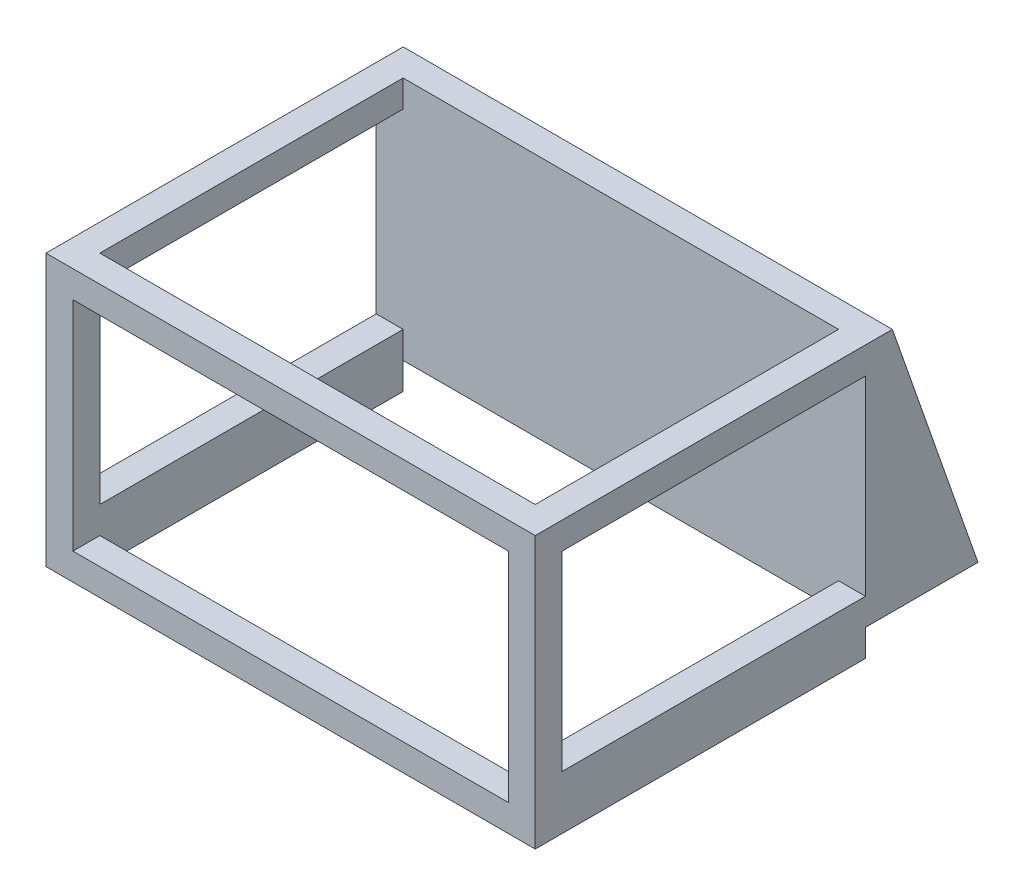
ISO-10303-21;
HEADER;
FILE_DESCRIPTION(('STEP AP214'),'2;1');
FILE_NAME('part.step','',(''),(''),'','','');
FILE_SCHEMA(('AUTOMOTIVE_DESIGN { 1 0 10303 214 1 1 1 1 }'));
ENDSEC;
DATA;
#1=APPLICATION_CONTEXT('core data for automotive mechanical design processes');
#2=APPLICATION_PROTOCOL_DEFINITION('international standard','automotive_design',2000,#1);
#3=PRODUCT_CONTEXT('',#1,'mechanical');
#4=PRODUCT('Part','Part','',(#3));
#5=PRODUCT_RELATED_PRODUCT_CATEGORY('part','',(#4));
#6=PRODUCT_DEFINITION_FORMATION('','',#4);
#7=PRODUCT_DEFINITION_CONTEXT('part definition',#1,'design');
#8=PRODUCT_DEFINITION('design','',#6,#7);
#9=PRODUCT_DEFINITION_SHAPE('','',#8);
#10=(LENGTH_UNIT() NAMED_UNIT(*) SI_UNIT(.MILLI.,.METRE.));
#11=(NAMED_UNIT(*) PLANE_ANGLE_UNIT() SI_UNIT($,.RADIAN.));
#12=(NAMED_UNIT(*) SI_UNIT($,.STERADIAN.) SOLID_ANGLE_UNIT());
#13=UNCERTAINTY_MEASURE_WITH_UNIT(LENGTH_MEASURE(1.E-05),#10,'distance_accuracy_value','');
#14=(GEOMETRIC_REPRESENTATION_CONTEXT(3) GLOBAL_UNCERTAINTY_ASSIGNED_CONTEXT((#13)) GLOBAL_UNIT_ASSIGNED_CONTEXT((#10,
#11,#12)) REPRESENTATION_CONTEXT('',''));
#15=CARTESIAN_POINT('',(0.,0.,0.));
#16=DIRECTION('',(0.,0.,1.));
#17=DIRECTION('',(1.,0.,0.));
#18=AXIS2_PLACEMENT_3D('',#15,#16,#17);
#19=CARTESIAN_POINT('',(0.,0.,0.));
#20=DIRECTION('',(0.,0.,1.));
#21=DIRECTION('',(1.,0.,0.));
#22=AXIS2_PLACEMENT_3D('',#19,#20,#21);
#23=PLANE('',#22);
#24=DIRECTION('',(0.,1.,0.));
#25=VECTOR('',#24,1.);
#26=CARTESIAN_POINT('',(-158.07662835249,-108.429118773946,0.));
#27=LINE('',#26,#25);
#28=CARTESIAN_POINT('',(-158.07662835249,-108.429118773946,0.));
#29=VERTEX_POINT('',#28);
#30=CARTESIAN_POINT('',(-158.07662835249,91.5708812260536,0.));
#31=VERTEX_POINT('',#30);
#32=EDGE_CURVE('E218',#29,#31,#27,.T.);
#33=ORIENTED_EDGE('',*,*,#32,.T.);
#34=DIRECTION('',(-1.,0.,0.));
#35=VECTOR('',#34,1.);
#36=CARTESIAN_POINT('',(-180.07662835249,91.5708812260537,0.));
#37=LINE('',#36,#35);
#38=CARTESIAN_POINT('',(197.92337164751,91.5708812260537,0.));
#39=VERTEX_POINT('',#38);
#40=EDGE_CURVE('E223',#39,#31,#37,.T.);
#41=ORIENTED_EDGE('',*,*,#40,.F.);
#42=DIRECTION('',(0.,-1.,0.));
#43=VECTOR('',#42,1.);
#44=CARTESIAN_POINT('',(197.92337164751,-108.429118773946,0.));
#45=LINE('',#44,#43);
#46=CARTESIAN_POINT('',(197.92337164751,-108.429118773946,0.));
#47=VERTEX_POINT('',#46);
#48=EDGE_CURVE('E356',#39,#47,#45,.T.);
#49=ORIENTED_EDGE('',*,*,#48,.T.);
#50=DIRECTION('',(1.,0.,0.));
#51=VECTOR('',#50,1.);
#52=CARTESIAN_POINT('',(-180.07662835249,-108.429118773946,0.));
#53=LINE('',#52,#51);
#54=EDGE_CURVE('E37',#29,#47,#53,.T.);
#55=ORIENTED_EDGE('',*,*,#54,.F.);
#56=EDGE_LOOP('',(#33,#41,#49,#55));
#57=FACE_BOUND('',#56,.T.);
#58=ADVANCED_FACE('F33',(#57),#23,.F.);
#59=CARTESIAN_POINT('',(-158.07662835249,91.5708812260537,270.));
#60=DIRECTION('',(0.,0.,1.));
#61=DIRECTION('',(1.,0.,0.));
#62=AXIS2_PLACEMENT_3D('',#59,#60,#61);
#63=PLANE('',#62);
#64=DIRECTION('',(1.,0.,0.));
#65=VECTOR('',#64,1.);
#66=CARTESIAN_POINT('',(-180.07662835249,69.5708812260536,270.));
#67=LINE('',#66,#65);
#68=CARTESIAN_POINT('',(-180.07662835249,69.5708812260536,270.));
#69=VERTEX_POINT('',#68);
#70=CARTESIAN_POINT('',(-158.07662835249,69.5708812260536,270.));
#71=VERTEX_POINT('',#70);
#72=EDGE_CURVE('E281',#69,#71,#67,.T.);
#73=ORIENTED_EDGE('',*,*,#72,.T.);
#74=DIRECTION('',(0.,-1.,0.));
#75=VECTOR('',#74,1.);
#76=CARTESIAN_POINT('',(-158.07662835249,91.5708812260537,270.));
#77=LINE('',#76,#75);
#78=CARTESIAN_POINT('',(-158.07662835249,-86.4291187739464,270.));
#79=VERTEX_POINT('',#78);
#80=EDGE_CURVE('E293',#71,#79,#77,.T.);
#81=ORIENTED_EDGE('',*,*,#80,.T.);
#82=DIRECTION('',(1.,0.,0.));
#83=VECTOR('',#82,1.);
#84=CARTESIAN_POINT('',(-180.07662835249,-86.4291187739464,270.));
#85=LINE('',#84,#83);
#86=CARTESIAN_POINT('',(-180.07662835249,-86.4291187739464,270.));
#87=VERTEX_POINT('',#86);
#88=EDGE_CURVE('E449',#87,#79,#85,.T.);
#89=ORIENTED_EDGE('',*,*,#88,.F.);
#90=DIRECTION('',(0.,-1.,0.));
#91=VECTOR('',#90,1.);
#92=CARTESIAN_POINT('',(-180.07662835249,69.5708812260536,270.));
#93=LINE('',#92,#91);
#94=EDGE_CURVE('E296',#69,#87,#93,.T.);
#95=ORIENTED_EDGE('',*,*,#94,.F.);
#96=EDGE_LOOP('',(#73,#81,#89,#95));
#97=FACE_BOUND('',#96,.T.);
#98=ADVANCED_FACE('F292',(#97),#63,.F.);
#99=DIRECTION('',(0.,-1.,0.));
#100=VECTOR('',#99,1.);
#101=CARTESIAN_POINT('',(197.92337164751,91.5708812260537,270.));
#102=LINE('',#101,#100);
#103=CARTESIAN_POINT('',(197.92337164751,91.5708812260537,270.));
#104=VERTEX_POINT('',#103);
#105=CARTESIAN_POINT('',(197.92337164751,69.5708812260536,270.));
#106=VERTEX_POINT('',#105);
#107=EDGE_CURVE('E269',#104,#106,#102,.T.);
#108=ORIENTED_EDGE('',*,*,#107,.T.);
#109=DIRECTION('',(-1.,0.,0.));
#110=VECTOR('',#109,1.);
#111=CARTESIAN_POINT('',(-158.07662835249,69.5708812260536,270.));
#112=LINE('',#111,#110);
#113=EDGE_CURVE('E43',#106,#71,#112,.T.);
#114=ORIENTED_EDGE('',*,*,#113,.T.);
#115=DIRECTION('',(0.,-1.,0.));
#116=VECTOR('',#115,1.);
#117=CARTESIAN_POINT('',(-158.07662835249,91.5708812260537,270.));
#118=LINE('',#117,#116);
#119=CARTESIAN_POINT('',(-158.07662835249,91.5708812260537,270.));
#120=VERTEX_POINT('',#119);
#121=EDGE_CURVE('E230',#120,#71,#118,.T.);
#122=ORIENTED_EDGE('',*,*,#121,.F.);
#123=DIRECTION('',(-1.,0.,0.));
#124=VECTOR('',#123,1.);
#125=CARTESIAN_POINT('',(-158.07662835249,91.5708812260537,270.));
#126=LINE('',#125,#124);
#127=EDGE_CURVE('E308',#104,#120,#126,.T.);
#128=ORIENTED_EDGE('',*,*,#127,.F.);
#129=EDGE_LOOP('',(#108,#114,#122,#128));
#130=FACE_BOUND('',#129,.T.);
#131=ADVANCED_FACE('F265',(#130),#63,.F.);
#132=CARTESIAN_POINT('',(197.92337164751,-86.4291187739464,270.));
#133=VERTEX_POINT('',#132);
#134=CARTESIAN_POINT('',(219.92337164751,-86.4291187739464,270.));
#135=VERTEX_POINT('',#134);
#136=EDGE_CURVE('E443',#133,#135,#85,.T.);
#137=ORIENTED_EDGE('',*,*,#136,.F.);
#138=DIRECTION('',(0.,1.,0.));
#139=VECTOR('',#138,1.);
#140=CARTESIAN_POINT('',(197.92337164751,91.5708812260537,270.));
#141=LINE('',#140,#139);
#142=EDGE_CURVE('E429',#133,#106,#141,.T.);
#143=ORIENTED_EDGE('',*,*,#142,.T.);
#144=CARTESIAN_POINT('',(219.92337164751,69.5708812260536,270.));
#145=VERTEX_POINT('',#144);
#146=EDGE_CURVE('E297',#106,#145,#67,.T.);
#147=ORIENTED_EDGE('',*,*,#146,.T.);
#148=DIRECTION('',(0.,-1.,0.));
#149=VECTOR('',#148,1.);
#150=CARTESIAN_POINT('',(219.92337164751,69.5708812260536,270.));
#151=LINE('',#150,#149);
#152=EDGE_CURVE('E435',#145,#135,#151,.T.);
#153=ORIENTED_EDGE('',*,*,#152,.T.);
#154=EDGE_LOOP('',(#137,#143,#147,#153));
#155=FACE_BOUND('',#154,.T.);
#156=ADVANCED_FACE('F474',(#155),#63,.F.);
#157=CARTESIAN_POINT('',(-158.07662835249,91.5708812260537,270.));
#158=DIRECTION('',(-1.,0.,0.));
#159=DIRECTION('',(0.,0.,1.));
#160=AXIS2_PLACEMENT_3D('',#157,#158,#159);
#161=PLANE('',#160);
#162=DIRECTION('',(0.,0.,-1.));
#163=VECTOR('',#162,1.);
#164=CARTESIAN_POINT('',(-158.07662835249,69.5708812260536,270.));
#165=LINE('',#164,#163);
#166=CARTESIAN_POINT('',(-158.07662835249,69.5708812260536,22.));
#167=VERTEX_POINT('',#166);
#168=EDGE_CURVE('E277',#71,#167,#165,.T.);
#169=ORIENTED_EDGE('',*,*,#168,.T.);
#170=DIRECTION('',(0.,1.,0.));
#171=VECTOR('',#170,1.);
#172=CARTESIAN_POINT('',(-158.07662835249,91.5708812260537,22.));
#173=LINE('',#172,#171);
#174=CARTESIAN_POINT('',(-158.07662835249,91.5708812260536,22.));
#175=VERTEX_POINT('',#174);
#176=EDGE_CURVE('E303',#167,#175,#173,.T.);
#177=ORIENTED_EDGE('',*,*,#176,.T.);
#178=DIRECTION('',(0.,0.,-1.));
#179=VECTOR('',#178,1.);
#180=CARTESIAN_POINT('',(-158.07662835249,91.5708812260537,270.));
#181=LINE('',#180,#179);
#182=EDGE_CURVE('E301',#120,#175,#181,.T.);
#183=ORIENTED_EDGE('',*,*,#182,.F.);
#184=ORIENTED_EDGE('',*,*,#121,.T.);
#185=EDGE_LOOP('',(#169,#177,#183,#184));
#186=FACE_BOUND('',#185,.T.);
#187=ADVANCED_FACE('F299',(#186),#161,.F.);
#188=CARTESIAN_POINT('',(197.92337164751,91.5708812260537,270.));
#189=DIRECTION('',(1.,0.,0.));
#190=DIRECTION('',(0.,0.,-1.));
#191=AXIS2_PLACEMENT_3D('',#188,#189,#190);
#192=PLANE('',#191);
#193=DIRECTION('',(0.,0.,1.));
#194=VECTOR('',#193,1.);
#195=CARTESIAN_POINT('',(197.92337164751,91.5708812260537,270.));
#196=LINE('',#195,#194);
#197=CARTESIAN_POINT('',(197.92337164751,91.5708812260537,22.0000000000001));
#198=VERTEX_POINT('',#197);
#199=EDGE_CURVE('E305',#198,#104,#196,.T.);
#200=ORIENTED_EDGE('',*,*,#199,.F.);
#201=DIRECTION('',(0.,-1.,0.));
#202=VECTOR('',#201,1.);
#203=CARTESIAN_POINT('',(197.92337164751,91.5708812260537,22.));
#204=LINE('',#203,#202);
#205=CARTESIAN_POINT('',(197.92337164751,69.5708812260536,22.));
#206=VERTEX_POINT('',#205);
#207=EDGE_CURVE('E387',#198,#206,#204,.T.);
#208=ORIENTED_EDGE('',*,*,#207,.T.);
#209=DIRECTION('',(0.,0.,1.));
#210=VECTOR('',#209,1.);
#211=CARTESIAN_POINT('',(197.92337164751,69.5708812260536,270.));
#212=LINE('',#211,#210);
#213=EDGE_CURVE('E259',#206,#106,#212,.T.);
#214=ORIENTED_EDGE('',*,*,#213,.T.);
#215=ORIENTED_EDGE('',*,*,#107,.F.);
#216=EDGE_LOOP('',(#200,#208,#214,#215));
#217=FACE_BOUND('',#216,.T.);
#218=ADVANCED_FACE('F466',(#217),#192,.F.);
#219=CARTESIAN_POINT('',(-180.07662835249,91.5708812260537,292.));
#220=DIRECTION('',(1.,0.,0.));
#221=DIRECTION('',(0.,0.,-1.));
#222=AXIS2_PLACEMENT_3D('',#219,#220,#221);
#223=PLANE('',#222);
#224=DIRECTION('',(0.,-1.,0.));
#225=VECTOR('',#224,1.);
#226=CARTESIAN_POINT('',(-180.07662835249,-108.429118773946,22.));
#227=LINE('',#226,#225);
#228=CARTESIAN_POINT('',(-180.07662835249,69.5708812260536,22.));
#229=VERTEX_POINT('',#228);
#230=CARTESIAN_POINT('',(-180.07662835249,-86.4291187739464,22.));
#231=VERTEX_POINT('',#230);
#232=EDGE_CURVE('E367',#229,#231,#227,.T.);
#233=ORIENTED_EDGE('',*,*,#232,.F.);
#234=DIRECTION('',(0.,0.,1.));
#235=VECTOR('',#234,1.);
#236=CARTESIAN_POINT('',(-180.07662835249,69.5708812260536,270.));
#237=LINE('',#236,#235);
#238=EDGE_CURVE('E441',#229,#69,#237,.T.);
#239=ORIENTED_EDGE('',*,*,#238,.T.);
#240=ORIENTED_EDGE('',*,*,#94,.T.);
#241=DIRECTION('',(0.,0.,-1.));
#242=VECTOR('',#241,1.);
#243=CARTESIAN_POINT('',(-180.07662835249,-86.4291187739464,270.));
#244=LINE('',#243,#242);
#245=EDGE_CURVE('E437',#87,#231,#244,.T.);
#246=ORIENTED_EDGE('',*,*,#245,.T.);
#247=EDGE_LOOP('',(#233,#239,#240,#246));
#248=FACE_BOUND('',#247,.T.);
#249=DIRECTION('',(0.,0.,-1.));
#250=VECTOR('',#249,1.);
#251=CARTESIAN_POINT('',(-180.07662835249,91.5708812260537,292.));
#252=LINE('',#251,#250);
#253=CARTESIAN_POINT('',(-180.07662835249,91.5708812260537,292.));
#254=VERTEX_POINT('',#253);
#255=CARTESIAN_POINT('',(-180.07662835249,91.5708812260536,0.));
#256=VERTEX_POINT('',#255);
#257=EDGE_CURVE('E245',#254,#256,#252,.T.);
#258=ORIENTED_EDGE('',*,*,#257,.T.);
#259=DIRECTION('',(0.,-0.943858356366017,-0.330350424728106));
#260=VECTOR('',#259,1.);
#261=CARTESIAN_POINT('',(-180.07662835249,91.5708812260536,0.));
#262=LINE('',#261,#260);
#263=CARTESIAN_POINT('',(-180.07662835249,-108.429118773946,-70.));
#264=VERTEX_POINT('',#263);
#265=EDGE_CURVE('E208',#256,#264,#262,.T.);
#266=ORIENTED_EDGE('',*,*,#265,.T.);
#267=DIRECTION('',(0.,0.,1.));
#268=VECTOR('',#267,1.);
#269=CARTESIAN_POINT('',(-180.07662835249,-108.429118773946,0.));
#270=LINE('',#269,#268);
#271=CARTESIAN_POINT('',(-180.07662835249,-108.429118773946,22.));
#272=VERTEX_POINT('',#271);
#273=EDGE_CURVE('E393',#264,#272,#270,.T.);
#274=ORIENTED_EDGE('',*,*,#273,.T.);
#275=DIRECTION('',(0.,-1.,0.));
#276=VECTOR('',#275,1.);
#277=CARTESIAN_POINT('',(-180.07662835249,-130.429118773946,22.));
#278=LINE('',#277,#276);
#279=CARTESIAN_POINT('',(-180.07662835249,-130.429118773946,22.));
#280=VERTEX_POINT('',#279);
#281=EDGE_CURVE('E336',#272,#280,#278,.T.);
#282=ORIENTED_EDGE('',*,*,#281,.T.);
#283=DIRECTION('',(0.,0.,-1.));
#284=VECTOR('',#283,1.);
#285=CARTESIAN_POINT('',(-180.07662835249,-130.429118773946,292.));
#286=LINE('',#285,#284);
#287=CARTESIAN_POINT('',(-180.07662835249,-130.429118773946,292.));
#288=VERTEX_POINT('',#287);
#289=EDGE_CURVE('E253',#288,#280,#286,.T.);
#290=ORIENTED_EDGE('',*,*,#289,.F.);
#291=DIRECTION('',(0.,-1.,0.));
#292=VECTOR('',#291,1.);
#293=CARTESIAN_POINT('',(-180.07662835249,91.5708812260537,292.));
#294=LINE('',#293,#292);
#295=EDGE_CURVE('E232',#254,#288,#294,.T.);
#296=ORIENTED_EDGE('',*,*,#295,.F.);
#297=EDGE_LOOP('',(#258,#266,#274,#282,#290,#296));
#298=FACE_BOUND('',#297,.T.);
#299=ADVANCED_FACE('F35',(#248,#298),#223,.F.);
#300=CARTESIAN_POINT('',(-180.07662835249,-130.429118773946,292.));
#301=DIRECTION('',(0.,1.,0.));
#302=DIRECTION('',(0.,0.,1.));
#303=AXIS2_PLACEMENT_3D('',#300,#301,#302);
#304=PLANE('',#303);
#305=ORIENTED_EDGE('',*,*,#289,.T.);
#306=DIRECTION('',(1.,0.,0.));
#307=VECTOR('',#306,1.);
#308=CARTESIAN_POINT('',(-180.07662835249,-130.429118773946,22.));
#309=LINE('',#308,#307);
#310=CARTESIAN_POINT('',(-158.07662835249,-130.429118773946,22.));
#311=VERTEX_POINT('',#310);
#312=EDGE_CURVE('E341',#280,#311,#309,.T.);
#313=ORIENTED_EDGE('',*,*,#312,.T.);
#314=DIRECTION('',(0.,0.,-1.));
#315=VECTOR('',#314,1.);
#316=CARTESIAN_POINT('',(-158.07662835249,-130.429118773946,270.));
#317=LINE('',#316,#315);
#318=CARTESIAN_POINT('',(-158.07662835249,-130.429118773946,270.));
#319=VERTEX_POINT('',#318);
#320=EDGE_CURVE('E287',#319,#311,#317,.T.);
#321=ORIENTED_EDGE('',*,*,#320,.F.);
#322=DIRECTION('',(-1.,0.,0.));
#323=VECTOR('',#322,1.);
#324=CARTESIAN_POINT('',(-158.07662835249,-130.429118773946,270.));
#325=LINE('',#324,#323);
#326=CARTESIAN_POINT('',(197.92337164751,-130.429118773946,270.));
#327=VERTEX_POINT('',#326);
#328=EDGE_CURVE('E306',#327,#319,#325,.T.);
#329=ORIENTED_EDGE('',*,*,#328,.F.);
#330=DIRECTION('',(0.,0.,1.));
#331=VECTOR('',#330,1.);
#332=CARTESIAN_POINT('',(197.92337164751,-130.429118773946,270.));
#333=LINE('',#332,#331);
#334=CARTESIAN_POINT('',(197.92337164751,-130.429118773946,22.));
#335=VERTEX_POINT('',#334);
#336=EDGE_CURVE('E317',#335,#327,#333,.T.);
#337=ORIENTED_EDGE('',*,*,#336,.F.);
#338=CARTESIAN_POINT('',(219.92337164751,-130.429118773946,22.));
#339=VERTEX_POINT('',#338);
#340=EDGE_CURVE('E345',#335,#339,#309,.T.);
#341=ORIENTED_EDGE('',*,*,#340,.T.);
#342=DIRECTION('',(0.,0.,-1.));
#343=VECTOR('',#342,1.);
#344=CARTESIAN_POINT('',(219.92337164751,-130.429118773946,292.));
#345=LINE('',#344,#343);
#346=CARTESIAN_POINT('',(219.92337164751,-130.429118773946,292.));
#347=VERTEX_POINT('',#346);
#348=EDGE_CURVE('E250',#347,#339,#345,.T.);
#349=ORIENTED_EDGE('',*,*,#348,.F.);
#350=DIRECTION('',(1.,0.,0.));
#351=VECTOR('',#350,1.);
#352=CARTESIAN_POINT('',(-180.07662835249,-130.429118773946,292.));
#353=LINE('',#352,#351);
#354=EDGE_CURVE('E323',#288,#347,#353,.T.);
#355=ORIENTED_EDGE('',*,*,#354,.F.);
#356=EDGE_LOOP('',(#305,#313,#321,#329,#337,#341,#349,#355));
#357=FACE_BOUND('',#356,.T.);
#358=ADVANCED_FACE('F339',(#357),#304,.F.);
#359=CARTESIAN_POINT('',(219.92337164751,91.5708812260537,292.));
#360=DIRECTION('',(-1.,0.,0.));
#361=DIRECTION('',(0.,-1.,0.));
#362=AXIS2_PLACEMENT_3D('',#359,#360,#361);
#363=PLANE('',#362);
#364=DIRECTION('',(0.,-1.,0.));
#365=VECTOR('',#364,1.);
#366=CARTESIAN_POINT('',(219.92337164751,-108.429118773946,22.));
#367=LINE('',#366,#365);
#368=CARTESIAN_POINT('',(219.92337164751,69.5708812260537,22.));
#369=VERTEX_POINT('',#368);
#370=CARTESIAN_POINT('',(219.92337164751,-86.4291187739464,22.));
#371=VERTEX_POINT('',#370);
#372=EDGE_CURVE('E365',#369,#371,#367,.T.);
#373=ORIENTED_EDGE('',*,*,#372,.T.);
#374=DIRECTION('',(0.,0.,-1.));
#375=VECTOR('',#374,1.);
#376=CARTESIAN_POINT('',(219.92337164751,-86.4291187739464,270.));
#377=LINE('',#376,#375);
#378=EDGE_CURVE('E446',#135,#371,#377,.T.);
#379=ORIENTED_EDGE('',*,*,#378,.F.);
#380=ORIENTED_EDGE('',*,*,#152,.F.);
#381=DIRECTION('',(0.,0.,1.));
#382=VECTOR('',#381,1.);
#383=CARTESIAN_POINT('',(219.92337164751,69.5708812260536,270.));
#384=LINE('',#383,#382);
#385=EDGE_CURVE('E438',#369,#145,#384,.T.);
#386=ORIENTED_EDGE('',*,*,#385,.F.);
#387=EDGE_LOOP('',(#373,#379,#380,#386));
#388=FACE_BOUND('',#387,.T.);
#389=DIRECTION('',(0.,-1.,0.));
#390=VECTOR('',#389,1.);
#391=CARTESIAN_POINT('',(219.92337164751,-130.429118773946,22.));
#392=LINE('',#391,#390);
#393=CARTESIAN_POINT('',(219.92337164751,-108.429118773946,22.));
#394=VERTEX_POINT('',#393);
#395=EDGE_CURVE('E395',#394,#339,#392,.T.);
#396=ORIENTED_EDGE('',*,*,#395,.F.);
#397=DIRECTION('',(0.,0.,1.));
#398=VECTOR('',#397,1.);
#399=CARTESIAN_POINT('',(219.92337164751,-108.429118773946,0.));
#400=LINE('',#399,#398);
#401=CARTESIAN_POINT('',(219.92337164751,-108.429118773946,-70.));
#402=VERTEX_POINT('',#401);
#403=EDGE_CURVE('E353',#402,#394,#400,.T.);
#404=ORIENTED_EDGE('',*,*,#403,.F.);
#405=DIRECTION('',(0.,0.943858356366017,0.330350424728106));
#406=VECTOR('',#405,1.);
#407=CARTESIAN_POINT('',(219.92337164751,-108.429118773946,-70.));
#408=LINE('',#407,#406);
#409=CARTESIAN_POINT('',(219.92337164751,91.5708812260537,0.));
#410=VERTEX_POINT('',#409);
#411=EDGE_CURVE('E351',#402,#410,#408,.T.);
#412=ORIENTED_EDGE('',*,*,#411,.T.);
#413=DIRECTION('',(0.,0.,-1.));
#414=VECTOR('',#413,1.);
#415=CARTESIAN_POINT('',(219.92337164751,91.5708812260537,292.));
#416=LINE('',#415,#414);
#417=CARTESIAN_POINT('',(219.92337164751,91.5708812260537,292.));
#418=VERTEX_POINT('',#417);
#419=EDGE_CURVE('E248',#418,#410,#416,.T.);
#420=ORIENTED_EDGE('',*,*,#419,.F.);
#421=DIRECTION('',(0.,1.,0.));
#422=VECTOR('',#421,1.);
#423=CARTESIAN_POINT('',(219.92337164751,91.5708812260537,292.));
#424=LINE('',#423,#422);
#425=EDGE_CURVE('E324',#347,#418,#424,.T.);
#426=ORIENTED_EDGE('',*,*,#425,.F.);
#427=ORIENTED_EDGE('',*,*,#348,.T.);
#428=EDGE_LOOP('',(#396,#404,#412,#420,#426,#427));
#429=FACE_BOUND('',#428,.T.);
#430=ADVANCED_FACE('F348',(#388,#429),#363,.F.);
#431=CARTESIAN_POINT('',(-180.07662835249,91.5708812260537,292.));
#432=DIRECTION('',(0.,-1.,0.));
#433=DIRECTION('',(0.,0.,-1.));
#434=AXIS2_PLACEMENT_3D('',#431,#432,#433);
#435=PLANE('',#434);
#436=EDGE_CURVE('E229',#410,#39,#37,.T.);
#437=ORIENTED_EDGE('',*,*,#436,.T.);
#438=ORIENTED_EDGE('',*,*,#40,.T.);
#439=DIRECTION('',(-1.,0.,0.));
#440=VECTOR('',#439,1.);
#441=CARTESIAN_POINT('',(-158.07662835249,91.5708812260536,0.));
#442=LINE('',#441,#440);
#443=EDGE_CURVE('E202',#31,#256,#442,.T.);
#444=ORIENTED_EDGE('',*,*,#443,.T.);
#445=ORIENTED_EDGE('',*,*,#257,.F.);
#446=DIRECTION('',(-1.,0.,0.));
#447=VECTOR('',#446,1.);
#448=CARTESIAN_POINT('',(-180.07662835249,91.5708812260537,292.));
#449=LINE('',#448,#447);
#450=EDGE_CURVE('E243',#418,#254,#449,.T.);
#451=ORIENTED_EDGE('',*,*,#450,.F.);
#452=ORIENTED_EDGE('',*,*,#419,.T.);
#453=EDGE_LOOP('',(#437,#438,#444,#445,#451,#452));
#454=FACE_BOUND('',#453,.T.);
#455=ORIENTED_EDGE('',*,*,#182,.T.);
#456=DIRECTION('',(1.,0.,0.));
#457=VECTOR('',#456,1.);
#458=CARTESIAN_POINT('',(-180.07662835249,91.5708812260536,22.));
#459=LINE('',#458,#457);
#460=EDGE_CURVE('E369',#175,#198,#459,.T.);
#461=ORIENTED_EDGE('',*,*,#460,.T.);
#462=ORIENTED_EDGE('',*,*,#199,.T.);
#463=ORIENTED_EDGE('',*,*,#127,.T.);
#464=EDGE_LOOP('',(#455,#461,#462,#463));
#465=FACE_BOUND('',#464,.T.);
#466=ADVANCED_FACE('F226',(#454,#465),#435,.F.);
#467=CARTESIAN_POINT('',(0.,0.,292.));
#468=DIRECTION('',(0.,0.,1.));
#469=DIRECTION('',(1.,0.,0.));
#470=AXIS2_PLACEMENT_3D('',#467,#468,#469);
#471=PLANE('',#470);
#472=DIRECTION('',(0.,-1.,0.));
#473=VECTOR('',#472,1.);
#474=CARTESIAN_POINT('',(-158.07662835249,69.5708812260536,292.));
#475=LINE('',#474,#473);
#476=CARTESIAN_POINT('',(-158.07662835249,69.5708812260536,292.));
#477=VERTEX_POINT('',#476);
#478=CARTESIAN_POINT('',(-158.07662835249,-108.429118773946,292.));
#479=VERTEX_POINT('',#478);
#480=EDGE_CURVE('E408',#477,#479,#475,.T.);
#481=ORIENTED_EDGE('',*,*,#480,.F.);
#482=DIRECTION('',(-1.,0.,0.));
#483=VECTOR('',#482,1.);
#484=CARTESIAN_POINT('',(-158.07662835249,69.5708812260536,292.));
#485=LINE('',#484,#483);
#486=CARTESIAN_POINT('',(197.92337164751,69.5708812260536,292.));
#487=VERTEX_POINT('',#486);
#488=EDGE_CURVE('E416',#487,#477,#485,.T.);
#489=ORIENTED_EDGE('',*,*,#488,.F.);
#490=DIRECTION('',(0.,1.,0.));
#491=VECTOR('',#490,1.);
#492=CARTESIAN_POINT('',(197.92337164751,69.5708812260536,292.));
#493=LINE('',#492,#491);
#494=CARTESIAN_POINT('',(197.92337164751,-108.429118773946,292.));
#495=VERTEX_POINT('',#494);
#496=EDGE_CURVE('E413',#495,#487,#493,.T.);
#497=ORIENTED_EDGE('',*,*,#496,.F.);
#498=DIRECTION('',(1.,0.,0.));
#499=VECTOR('',#498,1.);
#500=CARTESIAN_POINT('',(-158.07662835249,-108.429118773946,292.));
#501=LINE('',#500,#499);
#502=EDGE_CURVE('E410',#479,#495,#501,.T.);
#503=ORIENTED_EDGE('',*,*,#502,.F.);
#504=EDGE_LOOP('',(#481,#489,#497,#503));
#505=FACE_BOUND('',#504,.T.);
#506=ORIENTED_EDGE('',*,*,#295,.T.);
#507=ORIENTED_EDGE('',*,*,#354,.T.);
#508=ORIENTED_EDGE('',*,*,#425,.T.);
#509=ORIENTED_EDGE('',*,*,#450,.T.);
#510=EDGE_LOOP('',(#506,#507,#508,#509));
#511=FACE_BOUND('',#510,.T.);
#512=ADVANCED_FACE('F329',(#505,#511),#471,.T.);
#513=DIRECTION('',(0.,1.,0.));
#514=VECTOR('',#513,1.);
#515=CARTESIAN_POINT('',(-158.07662835249,91.5708812260537,22.));
#516=LINE('',#515,#514);
#517=CARTESIAN_POINT('',(-158.07662835249,-108.429118773946,22.));
#518=VERTEX_POINT('',#517);
#519=EDGE_CURVE('E400',#311,#518,#516,.T.);
#520=ORIENTED_EDGE('',*,*,#519,.T.);
#521=DIRECTION('',(0.,1.,0.));
#522=VECTOR('',#521,1.);
#523=CARTESIAN_POINT('',(-158.07662835249,91.5708812260537,22.));
#524=LINE('',#523,#522);
#525=CARTESIAN_POINT('',(-158.07662835249,-86.4291187739464,22.));
#526=VERTEX_POINT('',#525);
#527=EDGE_CURVE('E379',#518,#526,#524,.T.);
#528=ORIENTED_EDGE('',*,*,#527,.T.);
#529=DIRECTION('',(0.,0.,1.));
#530=VECTOR('',#529,1.);
#531=CARTESIAN_POINT('',(-158.07662835249,-86.4291187739464,270.));
#532=LINE('',#531,#530);
#533=EDGE_CURVE('E288',#526,#79,#532,.T.);
#534=ORIENTED_EDGE('',*,*,#533,.T.);
#535=ORIENTED_EDGE('',*,*,#80,.F.);
#536=DIRECTION('',(0.,0.,1.));
#537=VECTOR('',#536,1.);
#538=CARTESIAN_POINT('',(-158.07662835249,69.5708812260536,0.));
#539=LINE('',#538,#537);
#540=EDGE_CURVE('E420',#71,#477,#539,.T.);
#541=ORIENTED_EDGE('',*,*,#540,.T.);
#542=ORIENTED_EDGE('',*,*,#480,.T.);
#543=DIRECTION('',(0.,0.,1.));
#544=VECTOR('',#543,1.);
#545=CARTESIAN_POINT('',(-158.07662835249,-108.429118773946,0.));
#546=LINE('',#545,#544);
#547=CARTESIAN_POINT('',(-158.07662835249,-108.429118773946,270.));
#548=VERTEX_POINT('',#547);
#549=EDGE_CURVE('E419',#548,#479,#546,.T.);
#550=ORIENTED_EDGE('',*,*,#549,.F.);
#551=EDGE_CURVE('E235',#548,#319,#118,.T.);
#552=ORIENTED_EDGE('',*,*,#551,.T.);
#553=ORIENTED_EDGE('',*,*,#320,.T.);
#554=EDGE_LOOP('',(#520,#528,#534,#535,#541,#542,#550,#552,#553));
#555=FACE_BOUND('',#554,.T.);
#556=ADVANCED_FACE('F453',(#555),#161,.F.);
#557=ORIENTED_EDGE('',*,*,#551,.F.);
#558=DIRECTION('',(1.,0.,0.));
#559=VECTOR('',#558,1.);
#560=CARTESIAN_POINT('',(-158.07662835249,-108.429118773946,270.));
#561=LINE('',#560,#559);
#562=CARTESIAN_POINT('',(197.92337164751,-108.429118773946,270.));
#563=VERTEX_POINT('',#562);
#564=EDGE_CURVE('E432',#548,#563,#561,.T.);
#565=ORIENTED_EDGE('',*,*,#564,.T.);
#566=EDGE_CURVE('E309',#563,#327,#102,.T.);
#567=ORIENTED_EDGE('',*,*,#566,.T.);
#568=ORIENTED_EDGE('',*,*,#328,.T.);
#569=EDGE_LOOP('',(#557,#565,#567,#568));
#570=FACE_BOUND('',#569,.T.);
#571=ADVANCED_FACE('F509',(#570),#63,.F.);
#572=DIRECTION('',(0.,0.,-1.));
#573=VECTOR('',#572,1.);
#574=CARTESIAN_POINT('',(197.92337164751,-86.4291187739464,270.));
#575=LINE('',#574,#573);
#576=CARTESIAN_POINT('',(197.92337164751,-86.4291187739464,22.));
#577=VERTEX_POINT('',#576);
#578=EDGE_CURVE('E256',#133,#577,#575,.T.);
#579=ORIENTED_EDGE('',*,*,#578,.T.);
#580=DIRECTION('',(0.,-1.,0.));
#581=VECTOR('',#580,1.);
#582=CARTESIAN_POINT('',(197.92337164751,91.5708812260537,22.));
#583=LINE('',#582,#581);
#584=CARTESIAN_POINT('',(197.92337164751,-108.429118773946,22.));
#585=VERTEX_POINT('',#584);
#586=EDGE_CURVE('E391',#577,#585,#583,.T.);
#587=ORIENTED_EDGE('',*,*,#586,.T.);
#588=DIRECTION('',(0.,-1.,0.));
#589=VECTOR('',#588,1.);
#590=CARTESIAN_POINT('',(197.92337164751,91.5708812260537,22.));
#591=LINE('',#590,#589);
#592=EDGE_CURVE('E11',#585,#335,#591,.T.);
#593=ORIENTED_EDGE('',*,*,#592,.T.);
#594=ORIENTED_EDGE('',*,*,#336,.T.);
#595=ORIENTED_EDGE('',*,*,#566,.F.);
#596=DIRECTION('',(0.,0.,1.));
#597=VECTOR('',#596,1.);
#598=CARTESIAN_POINT('',(197.92337164751,-108.429118773946,0.));
#599=LINE('',#598,#597);
#600=EDGE_CURVE('E424',#563,#495,#599,.T.);
#601=ORIENTED_EDGE('',*,*,#600,.T.);
#602=ORIENTED_EDGE('',*,*,#496,.T.);
#603=DIRECTION('',(0.,0.,1.));
#604=VECTOR('',#603,1.);
#605=CARTESIAN_POINT('',(197.92337164751,69.5708812260536,0.));
#606=LINE('',#605,#604);
#607=EDGE_CURVE('E422',#106,#487,#606,.T.);
#608=ORIENTED_EDGE('',*,*,#607,.F.);
#609=ORIENTED_EDGE('',*,*,#142,.F.);
#610=EDGE_LOOP('',(#579,#587,#593,#594,#595,#601,#602,#608,#609));
#611=FACE_BOUND('',#610,.T.);
#612=ADVANCED_FACE('F484',(#611),#192,.F.);
#613=CARTESIAN_POINT('',(-180.07662835249,-86.4291187739464,270.));
#614=DIRECTION('',(0.,-1.,0.));
#615=DIRECTION('',(1.,0.,0.));
#616=AXIS2_PLACEMENT_3D('',#613,#614,#615);
#617=PLANE('',#616);
#618=ORIENTED_EDGE('',*,*,#378,.T.);
#619=DIRECTION('',(-1.,0.,0.));
#620=VECTOR('',#619,1.);
#621=CARTESIAN_POINT('',(-180.07662835249,-86.4291187739464,22.));
#622=LINE('',#621,#620);
#623=EDGE_CURVE('E389',#371,#577,#622,.T.);
#624=ORIENTED_EDGE('',*,*,#623,.T.);
#625=ORIENTED_EDGE('',*,*,#578,.F.);
#626=ORIENTED_EDGE('',*,*,#136,.T.);
#627=EDGE_LOOP('',(#618,#624,#625,#626));
#628=FACE_BOUND('',#627,.T.);
#629=ADVANCED_FACE('F479',(#628),#617,.F.);
#630=CARTESIAN_POINT('',(-180.07662835249,69.5708812260536,270.));
#631=DIRECTION('',(0.,1.,0.));
#632=DIRECTION('',(-1.,0.,0.));
#633=AXIS2_PLACEMENT_3D('',#630,#631,#632);
#634=PLANE('',#633);
#635=ORIENTED_EDGE('',*,*,#213,.F.);
#636=DIRECTION('',(1.,0.,0.));
#637=VECTOR('',#636,1.);
#638=CARTESIAN_POINT('',(-180.07662835249,69.5708812260536,22.));
#639=LINE('',#638,#637);
#640=EDGE_CURVE('E384',#206,#369,#639,.T.);
#641=ORIENTED_EDGE('',*,*,#640,.T.);
#642=ORIENTED_EDGE('',*,*,#385,.T.);
#643=ORIENTED_EDGE('',*,*,#146,.F.);
#644=EDGE_LOOP('',(#635,#641,#642,#643));
#645=FACE_BOUND('',#644,.T.);
#646=ADVANCED_FACE('F469',(#645),#634,.F.);
#647=ORIENTED_EDGE('',*,*,#238,.F.);
#648=DIRECTION('',(1.,0.,0.));
#649=VECTOR('',#648,1.);
#650=CARTESIAN_POINT('',(-180.07662835249,69.5708812260536,22.));
#651=LINE('',#650,#649);
#652=EDGE_CURVE('E284',#229,#167,#651,.T.);
#653=ORIENTED_EDGE('',*,*,#652,.T.);
#654=ORIENTED_EDGE('',*,*,#168,.F.);
#655=ORIENTED_EDGE('',*,*,#72,.F.);
#656=EDGE_LOOP('',(#647,#653,#654,#655));
#657=FACE_BOUND('',#656,.T.);
#658=ADVANCED_FACE('F280',(#657),#634,.F.);
#659=ORIENTED_EDGE('',*,*,#533,.F.);
#660=DIRECTION('',(-1.,0.,0.));
#661=VECTOR('',#660,1.);
#662=CARTESIAN_POINT('',(-180.07662835249,-86.4291187739464,22.));
#663=LINE('',#662,#661);
#664=EDGE_CURVE('E375',#526,#231,#663,.T.);
#665=ORIENTED_EDGE('',*,*,#664,.T.);
#666=ORIENTED_EDGE('',*,*,#245,.F.);
#667=ORIENTED_EDGE('',*,*,#88,.T.);
#668=EDGE_LOOP('',(#659,#665,#666,#667));
#669=FACE_BOUND('',#668,.T.);
#670=ADVANCED_FACE('F455',(#669),#617,.F.);
#671=CARTESIAN_POINT('',(-158.07662835249,69.5708812260536,0.));
#672=DIRECTION('',(0.,1.,0.));
#673=DIRECTION('',(0.,0.,1.));
#674=AXIS2_PLACEMENT_3D('',#671,#672,#673);
#675=PLANE('',#674);
#676=ORIENTED_EDGE('',*,*,#607,.T.);
#677=ORIENTED_EDGE('',*,*,#488,.T.);
#678=ORIENTED_EDGE('',*,*,#540,.F.);
#679=ORIENTED_EDGE('',*,*,#113,.F.);
#680=EDGE_LOOP('',(#676,#677,#678,#679));
#681=FACE_BOUND('',#680,.T.);
#682=ADVANCED_FACE('F498',(#681),#675,.F.);
#683=CARTESIAN_POINT('',(-158.07662835249,-108.429118773946,0.));
#684=DIRECTION('',(0.,-1.,0.));
#685=DIRECTION('',(0.,0.,-1.));
#686=AXIS2_PLACEMENT_3D('',#683,#684,#685);
#687=PLANE('',#686);
#688=ORIENTED_EDGE('',*,*,#549,.T.);
#689=ORIENTED_EDGE('',*,*,#502,.T.);
#690=ORIENTED_EDGE('',*,*,#600,.F.);
#691=ORIENTED_EDGE('',*,*,#564,.F.);
#692=EDGE_LOOP('',(#688,#689,#690,#691));
#693=FACE_BOUND('',#692,.T.);
#694=ADVANCED_FACE('F491',(#693),#687,.F.);
#695=CARTESIAN_POINT('',(-180.07662835249,-130.429118773946,22.));
#696=DIRECTION('',(0.,0.,1.));
#697=DIRECTION('',(1.,0.,0.));
#698=AXIS2_PLACEMENT_3D('',#695,#696,#697);
#699=PLANE('',#698);
#700=DIRECTION('',(1.,0.,0.));
#701=VECTOR('',#700,1.);
#702=CARTESIAN_POINT('',(-180.07662835249,-108.429118773946,22.));
#703=LINE('',#702,#701);
#704=EDGE_CURVE('E403',#585,#394,#703,.T.);
#705=ORIENTED_EDGE('',*,*,#704,.T.);
#706=ORIENTED_EDGE('',*,*,#395,.T.);
#707=ORIENTED_EDGE('',*,*,#340,.F.);
#708=ORIENTED_EDGE('',*,*,#592,.F.);
#709=EDGE_LOOP('',(#705,#706,#707,#708));
#710=FACE_BOUND('',#709,.T.);
#711=ADVANCED_FACE('F488',(#710),#699,.F.);
#712=ORIENTED_EDGE('',*,*,#312,.F.);
#713=ORIENTED_EDGE('',*,*,#281,.F.);
#714=EDGE_CURVE('E401',#272,#518,#703,.T.);
#715=ORIENTED_EDGE('',*,*,#714,.T.);
#716=ORIENTED_EDGE('',*,*,#519,.F.);
#717=EDGE_LOOP('',(#712,#713,#715,#716));
#718=FACE_BOUND('',#717,.T.);
#719=ADVANCED_FACE('F490',(#718),#699,.F.);
#720=CARTESIAN_POINT('',(-180.07662835249,-108.429118773946,0.));
#721=DIRECTION('',(0.,1.,0.));
#722=DIRECTION('',(0.,0.,1.));
#723=AXIS2_PLACEMENT_3D('',#720,#721,#722);
#724=PLANE('',#723);
#725=ORIENTED_EDGE('',*,*,#714,.F.);
#726=ORIENTED_EDGE('',*,*,#273,.F.);
#727=DIRECTION('',(-1.,0.,0.));
#728=VECTOR('',#727,1.);
#729=CARTESIAN_POINT('',(-158.07662835249,-108.429118773946,-70.));
#730=LINE('',#729,#728);
#731=CARTESIAN_POINT('',(-158.07662835249,-108.429118773946,-70.));
#732=VERTEX_POINT('',#731);
#733=EDGE_CURVE('E213',#732,#264,#730,.T.);
#734=ORIENTED_EDGE('',*,*,#733,.F.);
#735=DIRECTION('',(0.,0.,1.));
#736=VECTOR('',#735,1.);
#737=CARTESIAN_POINT('',(-158.07662835249,-108.429118773946,0.));
#738=LINE('',#737,#736);
#739=EDGE_CURVE('E51',#732,#29,#738,.T.);
#740=ORIENTED_EDGE('',*,*,#739,.T.);
#741=ORIENTED_EDGE('',*,*,#54,.T.);
#742=DIRECTION('',(0.,0.,-1.));
#743=VECTOR('',#742,1.);
#744=CARTESIAN_POINT('',(197.92337164751,-108.429118773946,0.));
#745=LINE('',#744,#743);
#746=CARTESIAN_POINT('',(197.92337164751,-108.429118773946,-70.));
#747=VERTEX_POINT('',#746);
#748=EDGE_CURVE('E358',#47,#747,#745,.T.);
#749=ORIENTED_EDGE('',*,*,#748,.T.);
#750=DIRECTION('',(1.,0.,0.));
#751=VECTOR('',#750,1.);
#752=CARTESIAN_POINT('',(197.92337164751,-108.429118773946,-70.));
#753=LINE('',#752,#751);
#754=EDGE_CURVE('E363',#747,#402,#753,.T.);
#755=ORIENTED_EDGE('',*,*,#754,.T.);
#756=ORIENTED_EDGE('',*,*,#403,.T.);
#757=ORIENTED_EDGE('',*,*,#704,.F.);
#758=DIRECTION('',(1.,0.,0.));
#759=VECTOR('',#758,1.);
#760=CARTESIAN_POINT('',(-180.07662835249,-108.429118773946,22.));
#761=LINE('',#760,#759);
#762=EDGE_CURVE('E372',#518,#585,#761,.T.);
#763=ORIENTED_EDGE('',*,*,#762,.F.);
#764=EDGE_LOOP('',(#725,#726,#734,#740,#741,#749,#755,#756,#757,#763));
#765=FACE_BOUND('',#764,.T.);
#766=ADVANCED_FACE('F486',(#765),#724,.F.);
#767=CARTESIAN_POINT('',(-180.07662835249,-108.429118773946,22.));
#768=DIRECTION('',(0.,0.,1.));
#769=DIRECTION('',(0.,-1.,0.));
#770=AXIS2_PLACEMENT_3D('',#767,#768,#769);
#771=PLANE('',#770);
#772=ORIENTED_EDGE('',*,*,#586,.F.);
#773=ORIENTED_EDGE('',*,*,#623,.F.);
#774=ORIENTED_EDGE('',*,*,#372,.F.);
#775=ORIENTED_EDGE('',*,*,#640,.F.);
#776=ORIENTED_EDGE('',*,*,#207,.F.);
#777=ORIENTED_EDGE('',*,*,#460,.F.);
#778=ORIENTED_EDGE('',*,*,#176,.F.);
#779=ORIENTED_EDGE('',*,*,#652,.F.);
#780=ORIENTED_EDGE('',*,*,#232,.T.);
#781=ORIENTED_EDGE('',*,*,#664,.F.);
#782=ORIENTED_EDGE('',*,*,#527,.F.);
#783=ORIENTED_EDGE('',*,*,#762,.T.);
#784=EDGE_LOOP('',(#772,#773,#774,#775,#776,#777,#778,#779,#780,#781,#782,#783));
#785=FACE_BOUND('',#784,.T.);
#786=ADVANCED_FACE('F460',(#785),#771,.T.);
#787=CARTESIAN_POINT('',(197.92337164751,-108.429118773946,-70.));
#788=DIRECTION('',(0.,0.330350424728106,-0.943858356366018));
#789=DIRECTION('',(0.,0.943858356366018,0.330350424728106));
#790=AXIS2_PLACEMENT_3D('',#787,#788,#789);
#791=PLANE('',#790);
#792=ORIENTED_EDGE('',*,*,#411,.F.);
#793=ORIENTED_EDGE('',*,*,#754,.F.);
#794=DIRECTION('',(0.,0.943858356366017,0.330350424728106));
#795=VECTOR('',#794,1.);
#796=CARTESIAN_POINT('',(197.92337164751,-108.429118773946,-70.));
#797=LINE('',#796,#795);
#798=EDGE_CURVE('E366',#747,#39,#797,.T.);
#799=ORIENTED_EDGE('',*,*,#798,.T.);
#800=ORIENTED_EDGE('',*,*,#436,.F.);
#801=EDGE_LOOP('',(#792,#793,#799,#800));
#802=FACE_BOUND('',#801,.T.);
#803=ADVANCED_FACE('F668',(#802),#791,.T.);
#804=CARTESIAN_POINT('',(197.92337164751,0.,0.));
#805=DIRECTION('',(-1.,0.,0.));
#806=DIRECTION('',(0.,0.,1.));
#807=AXIS2_PLACEMENT_3D('',#804,#805,#806);
#808=PLANE('',#807);
#809=ORIENTED_EDGE('',*,*,#48,.F.);
#810=ORIENTED_EDGE('',*,*,#798,.F.);
#811=ORIENTED_EDGE('',*,*,#748,.F.);
#812=EDGE_LOOP('',(#809,#810,#811));
#813=FACE_BOUND('',#812,.T.);
#814=ADVANCED_FACE('F653',(#813),#808,.T.);
#815=CARTESIAN_POINT('',(-158.07662835249,91.5708812260536,0.));
#816=DIRECTION('',(0.,0.330350424728106,-0.943858356366018));
#817=DIRECTION('',(0.,0.943858356366018,0.330350424728106));
#818=AXIS2_PLACEMENT_3D('',#815,#816,#817);
#819=PLANE('',#818);
#820=ORIENTED_EDGE('',*,*,#265,.F.);
#821=ORIENTED_EDGE('',*,*,#443,.F.);
#822=DIRECTION('',(0.,-0.943858356366017,-0.330350424728106));
#823=VECTOR('',#822,1.);
#824=CARTESIAN_POINT('',(-158.07662835249,91.5708812260536,0.));
#825=LINE('',#824,#823);
#826=EDGE_CURVE('E206',#31,#732,#825,.T.);
#827=ORIENTED_EDGE('',*,*,#826,.T.);
#828=ORIENTED_EDGE('',*,*,#733,.T.);
#829=EDGE_LOOP('',(#820,#821,#827,#828));
#830=FACE_BOUND('',#829,.T.);
#831=ADVANCED_FACE('F204',(#830),#819,.T.);
#832=CARTESIAN_POINT('',(-158.07662835249,0.,0.));
#833=DIRECTION('',(-1.,0.,0.));
#834=DIRECTION('',(0.,0.,1.));
#835=AXIS2_PLACEMENT_3D('',#832,#833,#834);
#836=PLANE('',#835);
#837=ORIENTED_EDGE('',*,*,#32,.F.);
#838=ORIENTED_EDGE('',*,*,#739,.F.);
#839=ORIENTED_EDGE('',*,*,#826,.F.);
#840=EDGE_LOOP('',(#837,#838,#839));
#841=FACE_BOUND('',#840,.T.);
#842=ADVANCED_FACE('F217',(#841),#836,.F.);
#843=CLOSED_SHELL('',(#58,#98,#131,#156,#187,#218,#299,#358,#430,#466,#512,#556,#571,#612,#629,
#646,#658,#670,#682,#694,#711,#719,#766,#786,#803,#814,#831,#842));
#844=MANIFOLD_SOLID_BREP('B2',#843);
#845=ADVANCED_BREP_SHAPE_REPRESENTATION('',(#18,#844),#14);
#846=SHAPE_DEFINITION_REPRESENTATION(#9,#845);
ENDSEC;
END-ISO-10303-21;
